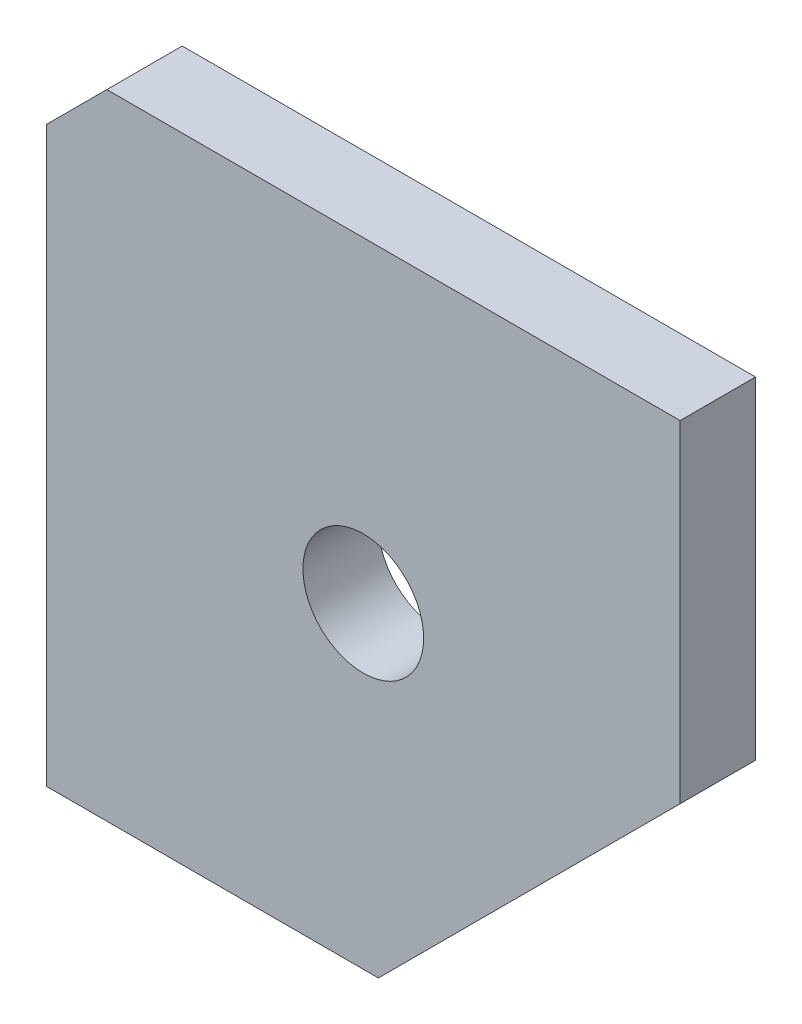
ISO-10303-21;
HEADER;
FILE_DESCRIPTION(('STEP AP214'),'2;1');
FILE_NAME('part.step','',(''),(''),'','','');
FILE_SCHEMA(('AUTOMOTIVE_DESIGN { 1 0 10303 214 1 1 1 1 }'));
ENDSEC;
DATA;
#1=APPLICATION_CONTEXT('core data for automotive mechanical design processes');
#2=APPLICATION_PROTOCOL_DEFINITION('international standard','automotive_design',2000,#1);
#3=PRODUCT_CONTEXT('',#1,'mechanical');
#4=PRODUCT('Part','Part','',(#3));
#5=PRODUCT_RELATED_PRODUCT_CATEGORY('part','',(#4));
#6=PRODUCT_DEFINITION_FORMATION('','',#4);
#7=PRODUCT_DEFINITION_CONTEXT('part definition',#1,'design');
#8=PRODUCT_DEFINITION('design','',#6,#7);
#9=PRODUCT_DEFINITION_SHAPE('','',#8);
#10=(LENGTH_UNIT() NAMED_UNIT(*) SI_UNIT(.MILLI.,.METRE.));
#11=(NAMED_UNIT(*) PLANE_ANGLE_UNIT() SI_UNIT($,.RADIAN.));
#12=(NAMED_UNIT(*) SI_UNIT($,.STERADIAN.) SOLID_ANGLE_UNIT());
#13=UNCERTAINTY_MEASURE_WITH_UNIT(LENGTH_MEASURE(1.E-05),#10,'distance_accuracy_value','');
#14=(GEOMETRIC_REPRESENTATION_CONTEXT(3) GLOBAL_UNCERTAINTY_ASSIGNED_CONTEXT((#13)) GLOBAL_UNIT_ASSIGNED_CONTEXT((#10,
#11,#12)) REPRESENTATION_CONTEXT('',''));
#15=CARTESIAN_POINT('',(0.,0.,0.));
#16=DIRECTION('',(0.,0.,1.));
#17=DIRECTION('',(1.,0.,0.));
#18=AXIS2_PLACEMENT_3D('',#15,#16,#17);
#19=CARTESIAN_POINT('',(21.,21.,5.));
#20=DIRECTION('',(1.,0.,0.));
#21=DIRECTION('',(0.,1.,0.));
#22=AXIS2_PLACEMENT_3D('',#19,#20,#21);
#23=PLANE('',#22);
#24=DIRECTION('',(0.,-1.,0.));
#25=VECTOR('',#24,1.);
#26=CARTESIAN_POINT('',(21.,21.,0.));
#27=LINE('',#26,#25);
#28=CARTESIAN_POINT('',(21.,21.,0.));
#29=VERTEX_POINT('',#28);
#30=CARTESIAN_POINT('',(21.,-0.999999999999996,0.));
#31=VERTEX_POINT('',#30);
#32=EDGE_CURVE('E118',#29,#31,#27,.T.);
#33=ORIENTED_EDGE('',*,*,#32,.F.);
#34=DIRECTION('',(0.,0.,-1.));
#35=VECTOR('',#34,1.);
#36=CARTESIAN_POINT('',(21.,21.,5.));
#37=LINE('',#36,#35);
#38=CARTESIAN_POINT('',(21.,21.,5.));
#39=VERTEX_POINT('',#38);
#40=EDGE_CURVE('E11',#39,#29,#37,.T.);
#41=ORIENTED_EDGE('',*,*,#40,.F.);
#42=DIRECTION('',(0.,-1.,0.));
#43=VECTOR('',#42,1.);
#44=CARTESIAN_POINT('',(21.,21.,5.));
#45=LINE('',#44,#43);
#46=CARTESIAN_POINT('',(21.,-0.999999999999996,5.));
#47=VERTEX_POINT('',#46);
#48=EDGE_CURVE('E133',#39,#47,#45,.T.);
#49=ORIENTED_EDGE('',*,*,#48,.T.);
#50=DIRECTION('',(0.,0.,-1.));
#51=VECTOR('',#50,1.);
#52=CARTESIAN_POINT('',(21.,-0.999999999999996,5.));
#53=LINE('',#52,#51);
#54=EDGE_CURVE('E36',#47,#31,#53,.T.);
#55=ORIENTED_EDGE('',*,*,#54,.T.);
#56=EDGE_LOOP('',(#33,#41,#49,#55));
#57=FACE_BOUND('',#56,.T.);
#58=ADVANCED_FACE('F33',(#57),#23,.T.);
#59=CARTESIAN_POINT('',(-17.,21.,5.));
#60=DIRECTION('',(0.,1.,0.));
#61=DIRECTION('',(0.,0.,1.));
#62=AXIS2_PLACEMENT_3D('',#59,#60,#61);
#63=PLANE('',#62);
#64=DIRECTION('',(1.,0.,0.));
#65=VECTOR('',#64,1.);
#66=CARTESIAN_POINT('',(-17.,21.,0.));
#67=LINE('',#66,#65);
#68=CARTESIAN_POINT('',(-17.,21.,0.));
#69=VERTEX_POINT('',#68);
#70=EDGE_CURVE('E131',#69,#29,#67,.T.);
#71=ORIENTED_EDGE('',*,*,#70,.F.);
#72=DIRECTION('',(0.,0.,-1.));
#73=VECTOR('',#72,1.);
#74=CARTESIAN_POINT('',(-17.,21.,5.));
#75=LINE('',#74,#73);
#76=CARTESIAN_POINT('',(-17.,21.,5.));
#77=VERTEX_POINT('',#76);
#78=EDGE_CURVE('E42',#77,#69,#75,.T.);
#79=ORIENTED_EDGE('',*,*,#78,.F.);
#80=DIRECTION('',(1.,0.,0.));
#81=VECTOR('',#80,1.);
#82=CARTESIAN_POINT('',(-17.,21.,5.));
#83=LINE('',#82,#81);
#84=EDGE_CURVE('E108',#77,#39,#83,.T.);
#85=ORIENTED_EDGE('',*,*,#84,.T.);
#86=ORIENTED_EDGE('',*,*,#40,.T.);
#87=EDGE_LOOP('',(#71,#79,#85,#86));
#88=FACE_BOUND('',#87,.T.);
#89=ADVANCED_FACE('F141',(#88),#63,.T.);
#90=CARTESIAN_POINT('',(-21.,17.,5.));
#91=DIRECTION('',(-0.707106781186547,0.707106781186548,0.));
#92=DIRECTION('',(-0.707106781186548,-0.707106781186547,0.));
#93=AXIS2_PLACEMENT_3D('',#90,#91,#92);
#94=PLANE('',#93);
#95=DIRECTION('',(0.707106781186548,0.707106781186547,0.));
#96=VECTOR('',#95,1.);
#97=CARTESIAN_POINT('',(-21.,17.,0.));
#98=LINE('',#97,#96);
#99=CARTESIAN_POINT('',(-21.,17.,0.));
#100=VERTEX_POINT('',#99);
#101=EDGE_CURVE('E95',#100,#69,#98,.T.);
#102=ORIENTED_EDGE('',*,*,#101,.F.);
#103=DIRECTION('',(0.,0.,-1.));
#104=VECTOR('',#103,1.);
#105=CARTESIAN_POINT('',(-21.,17.,5.));
#106=LINE('',#105,#104);
#107=CARTESIAN_POINT('',(-21.,17.,5.));
#108=VERTEX_POINT('',#107);
#109=EDGE_CURVE('E90',#108,#100,#106,.T.);
#110=ORIENTED_EDGE('',*,*,#109,.F.);
#111=DIRECTION('',(0.707106781186548,0.707106781186547,0.));
#112=VECTOR('',#111,1.);
#113=CARTESIAN_POINT('',(-21.,17.,5.));
#114=LINE('',#113,#112);
#115=EDGE_CURVE('E93',#108,#77,#114,.T.);
#116=ORIENTED_EDGE('',*,*,#115,.T.);
#117=ORIENTED_EDGE('',*,*,#78,.T.);
#118=EDGE_LOOP('',(#102,#110,#116,#117));
#119=FACE_BOUND('',#118,.T.);
#120=ADVANCED_FACE('F92',(#119),#94,.T.);
#121=CARTESIAN_POINT('',(-21.,-21.,5.));
#122=DIRECTION('',(-1.,0.,0.));
#123=DIRECTION('',(0.,-1.,0.));
#124=AXIS2_PLACEMENT_3D('',#121,#122,#123);
#125=PLANE('',#124);
#126=DIRECTION('',(0.,1.,0.));
#127=VECTOR('',#126,1.);
#128=CARTESIAN_POINT('',(-21.,-21.,0.));
#129=LINE('',#128,#127);
#130=CARTESIAN_POINT('',(-21.,-21.,0.));
#131=VERTEX_POINT('',#130);
#132=EDGE_CURVE('E128',#131,#100,#129,.T.);
#133=ORIENTED_EDGE('',*,*,#132,.F.);
#134=DIRECTION('',(0.,0.,-1.));
#135=VECTOR('',#134,1.);
#136=CARTESIAN_POINT('',(-21.,-21.,5.));
#137=LINE('',#136,#135);
#138=CARTESIAN_POINT('',(-21.,-21.,5.));
#139=VERTEX_POINT('',#138);
#140=EDGE_CURVE('E100',#139,#131,#137,.T.);
#141=ORIENTED_EDGE('',*,*,#140,.F.);
#142=DIRECTION('',(0.,1.,0.));
#143=VECTOR('',#142,1.);
#144=CARTESIAN_POINT('',(-21.,-21.,5.));
#145=LINE('',#144,#143);
#146=EDGE_CURVE('E106',#139,#108,#145,.T.);
#147=ORIENTED_EDGE('',*,*,#146,.T.);
#148=ORIENTED_EDGE('',*,*,#109,.T.);
#149=EDGE_LOOP('',(#133,#141,#147,#148));
#150=FACE_BOUND('',#149,.T.);
#151=ADVANCED_FACE('F110',(#150),#125,.T.);
#152=CARTESIAN_POINT('',(0.999999999999923,-21.,5.));
#153=DIRECTION('',(0.,-1.,0.));
#154=DIRECTION('',(1.,0.,0.));
#155=AXIS2_PLACEMENT_3D('',#152,#153,#154);
#156=PLANE('',#155);
#157=DIRECTION('',(-1.,0.,0.));
#158=VECTOR('',#157,1.);
#159=CARTESIAN_POINT('',(0.999999999999923,-21.,0.));
#160=LINE('',#159,#158);
#161=CARTESIAN_POINT('',(0.999999999999923,-21.,0.));
#162=VERTEX_POINT('',#161);
#163=EDGE_CURVE('E125',#162,#131,#160,.T.);
#164=ORIENTED_EDGE('',*,*,#163,.F.);
#165=DIRECTION('',(0.,0.,-1.));
#166=VECTOR('',#165,1.);
#167=CARTESIAN_POINT('',(0.999999999999923,-21.,5.));
#168=LINE('',#167,#166);
#169=CARTESIAN_POINT('',(0.999999999999923,-21.,5.));
#170=VERTEX_POINT('',#169);
#171=EDGE_CURVE('E136',#170,#162,#168,.T.);
#172=ORIENTED_EDGE('',*,*,#171,.F.);
#173=DIRECTION('',(-1.,0.,0.));
#174=VECTOR('',#173,1.);
#175=CARTESIAN_POINT('',(0.999999999999923,-21.,5.));
#176=LINE('',#175,#174);
#177=EDGE_CURVE('E111',#170,#139,#176,.T.);
#178=ORIENTED_EDGE('',*,*,#177,.T.);
#179=ORIENTED_EDGE('',*,*,#140,.T.);
#180=EDGE_LOOP('',(#164,#172,#178,#179));
#181=FACE_BOUND('',#180,.T.);
#182=ADVANCED_FACE('F154',(#181),#156,.T.);
#183=CARTESIAN_POINT('',(21.,-0.999999999999996,5.));
#184=DIRECTION('',(0.707106781186546,-0.707106781186549,0.));
#185=DIRECTION('',(0.707106781186549,0.707106781186546,0.));
#186=AXIS2_PLACEMENT_3D('',#183,#184,#185);
#187=PLANE('',#186);
#188=DIRECTION('',(-0.707106781186549,-0.707106781186546,0.));
#189=VECTOR('',#188,1.);
#190=CARTESIAN_POINT('',(21.,-0.999999999999996,0.));
#191=LINE('',#190,#189);
#192=EDGE_CURVE('E121',#31,#162,#191,.T.);
#193=ORIENTED_EDGE('',*,*,#192,.F.);
#194=ORIENTED_EDGE('',*,*,#54,.F.);
#195=DIRECTION('',(-0.707106781186549,-0.707106781186546,0.));
#196=VECTOR('',#195,1.);
#197=CARTESIAN_POINT('',(21.,-0.999999999999996,5.));
#198=LINE('',#197,#196);
#199=EDGE_CURVE('E113',#47,#170,#198,.T.);
#200=ORIENTED_EDGE('',*,*,#199,.T.);
#201=ORIENTED_EDGE('',*,*,#171,.T.);
#202=EDGE_LOOP('',(#193,#194,#200,#201));
#203=FACE_BOUND('',#202,.T.);
#204=ADVANCED_FACE('F138',(#203),#187,.T.);
#205=CARTESIAN_POINT('',(0.,0.,5.));
#206=DIRECTION('',(0.,0.,-1.));
#207=DIRECTION('',(-1.,0.,0.));
#208=AXIS2_PLACEMENT_3D('',#205,#206,#207);
#209=PLANE('',#208);
#210=CARTESIAN_POINT('',(0.,0.,5.));
#211=DIRECTION('',(0.,0.,-1.));
#212=DIRECTION('',(1.,0.,0.));
#213=AXIS2_PLACEMENT_3D('',#210,#211,#212);
#214=CIRCLE('',#213,4.);
#215=CARTESIAN_POINT('',(4.,0.,5.));
#216=VERTEX_POINT('',#215);
#217=EDGE_CURVE('E122',#216,#216,#214,.T.);
#218=ORIENTED_EDGE('',*,*,#217,.T.);
#219=EDGE_LOOP('',(#218));
#220=FACE_BOUND('',#219,.T.);
#221=ORIENTED_EDGE('',*,*,#48,.F.);
#222=ORIENTED_EDGE('',*,*,#84,.F.);
#223=ORIENTED_EDGE('',*,*,#115,.F.);
#224=ORIENTED_EDGE('',*,*,#146,.F.);
#225=ORIENTED_EDGE('',*,*,#177,.F.);
#226=ORIENTED_EDGE('',*,*,#199,.F.);
#227=EDGE_LOOP('',(#221,#222,#223,#224,#225,#226));
#228=FACE_BOUND('',#227,.T.);
#229=ADVANCED_FACE('F104',(#220,#228),#209,.F.);
#230=CARTESIAN_POINT('',(0.,0.,0.));
#231=DIRECTION('',(0.,0.,-1.));
#232=DIRECTION('',(-1.,0.,0.));
#233=AXIS2_PLACEMENT_3D('',#230,#231,#232);
#234=PLANE('',#233);
#235=CARTESIAN_POINT('',(0.,0.,0.));
#236=DIRECTION('',(0.,0.,-1.));
#237=DIRECTION('',(1.,0.,0.));
#238=AXIS2_PLACEMENT_3D('',#235,#236,#237);
#239=CIRCLE('',#238,4.);
#240=CARTESIAN_POINT('',(4.,0.,0.));
#241=VERTEX_POINT('',#240);
#242=EDGE_CURVE('E177',#241,#241,#239,.T.);
#243=ORIENTED_EDGE('',*,*,#242,.F.);
#244=EDGE_LOOP('',(#243));
#245=FACE_BOUND('',#244,.T.);
#246=ORIENTED_EDGE('',*,*,#32,.T.);
#247=ORIENTED_EDGE('',*,*,#192,.T.);
#248=ORIENTED_EDGE('',*,*,#163,.T.);
#249=ORIENTED_EDGE('',*,*,#132,.T.);
#250=ORIENTED_EDGE('',*,*,#101,.T.);
#251=ORIENTED_EDGE('',*,*,#70,.T.);
#252=EDGE_LOOP('',(#246,#247,#248,#249,#250,#251));
#253=FACE_BOUND('',#252,.T.);
#254=ADVANCED_FACE('F140',(#245,#253),#234,.T.);
#255=CARTESIAN_POINT('',(0.,0.,5.));
#256=DIRECTION('',(0.,0.,-1.));
#257=DIRECTION('',(-1.,0.,0.));
#258=AXIS2_PLACEMENT_3D('',#255,#256,#257);
#259=CYLINDRICAL_SURFACE('',#258,4.);
#260=ORIENTED_EDGE('',*,*,#217,.F.);
#261=EDGE_LOOP('',(#260));
#262=FACE_BOUND('',#261,.T.);
#263=ORIENTED_EDGE('',*,*,#242,.T.);
#264=EDGE_LOOP('',(#263));
#265=FACE_BOUND('',#264,.T.);
#266=ADVANCED_FACE('F165',(#262,#265),#259,.F.);
#267=CLOSED_SHELL('',(#58,#89,#120,#151,#182,#204,#229,#254,#266));
#268=MANIFOLD_SOLID_BREP('B2',#267);
#269=ADVANCED_BREP_SHAPE_REPRESENTATION('',(#18,#268),#14);
#270=SHAPE_DEFINITION_REPRESENTATION(#9,#269);
ENDSEC;
END-ISO-10303-21;
